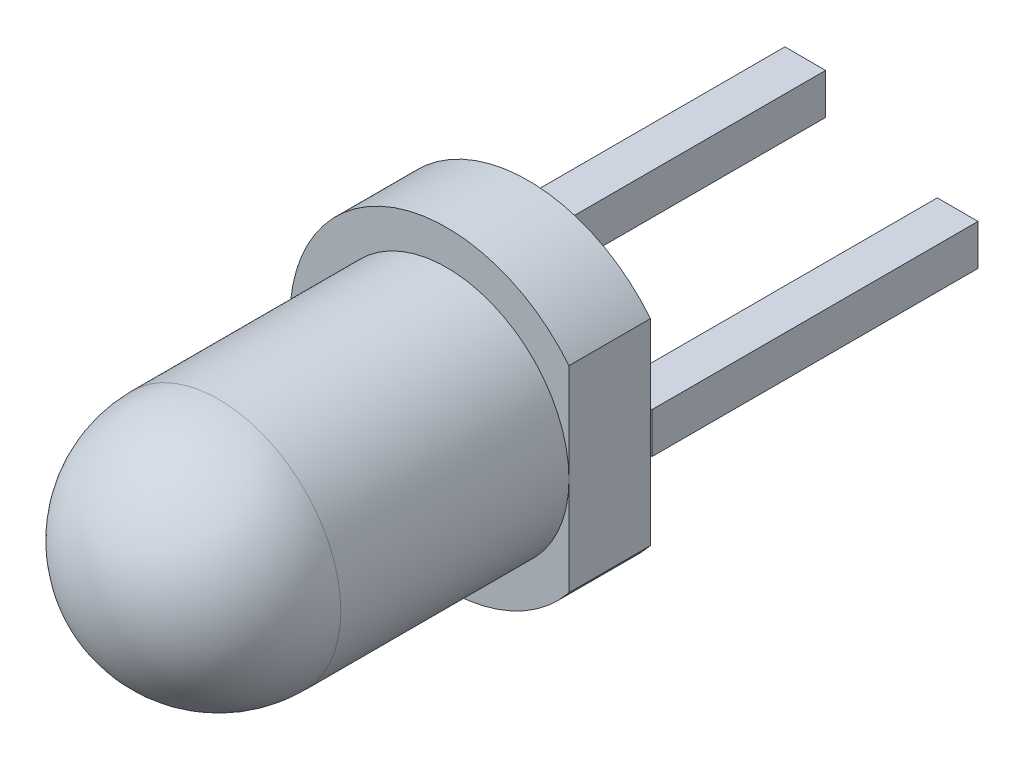
ISO-10303-21;
HEADER;
FILE_DESCRIPTION(('STEP AP214'),'2;1');
FILE_NAME('part.step','',(''),(''),'','','');
FILE_SCHEMA(('AUTOMOTIVE_DESIGN { 1 0 10303 214 1 1 1 1 }'));
ENDSEC;
DATA;
#1=APPLICATION_CONTEXT('core data for automotive mechanical design processes');
#2=APPLICATION_PROTOCOL_DEFINITION('international standard','automotive_design',2000,#1);
#3=PRODUCT_CONTEXT('',#1,'mechanical');
#4=PRODUCT('Part','Part','',(#3));
#5=PRODUCT_RELATED_PRODUCT_CATEGORY('part','',(#4));
#6=PRODUCT_DEFINITION_FORMATION('','',#4);
#7=PRODUCT_DEFINITION_CONTEXT('part definition',#1,'design');
#8=PRODUCT_DEFINITION('design','',#6,#7);
#9=PRODUCT_DEFINITION_SHAPE('','',#8);
#10=(LENGTH_UNIT() NAMED_UNIT(*) SI_UNIT(.MILLI.,.METRE.));
#11=(NAMED_UNIT(*) PLANE_ANGLE_UNIT() SI_UNIT($,.RADIAN.));
#12=(NAMED_UNIT(*) SI_UNIT($,.STERADIAN.) SOLID_ANGLE_UNIT());
#13=UNCERTAINTY_MEASURE_WITH_UNIT(LENGTH_MEASURE(1.E-05),#10,'distance_accuracy_value','');
#14=(GEOMETRIC_REPRESENTATION_CONTEXT(3) GLOBAL_UNCERTAINTY_ASSIGNED_CONTEXT((#13)) GLOBAL_UNIT_ASSIGNED_CONTEXT((#10,
#11,#12)) REPRESENTATION_CONTEXT('',''));
#15=CARTESIAN_POINT('',(0.,0.,0.));
#16=DIRECTION('',(0.,0.,1.));
#17=DIRECTION('',(1.,0.,0.));
#18=AXIS2_PLACEMENT_3D('',#15,#16,#17);
#19=CARTESIAN_POINT('',(-1.02,0.25,-26.4));
#20=DIRECTION('',(0.,1.,0.));
#21=DIRECTION('',(1.,0.,0.));
#22=AXIS2_PLACEMENT_3D('',#19,#20,#21);
#23=PLANE('',#22);
#24=DIRECTION('',(0.,0.,1.));
#25=VECTOR('',#24,1.);
#26=CARTESIAN_POINT('',(-1.02,0.25,-26.4));
#27=LINE('',#26,#25);
#28=CARTESIAN_POINT('',(-1.02,0.25,-4.67));
#29=VERTEX_POINT('',#28);
#30=CARTESIAN_POINT('',(-1.02,0.25,0.));
#31=VERTEX_POINT('',#30);
#32=EDGE_CURVE('E59',#29,#31,#27,.T.);
#33=ORIENTED_EDGE('',*,*,#32,.F.);
#34=DIRECTION('',(-1.,0.,0.));
#35=VECTOR('',#34,1.);
#36=CARTESIAN_POINT('',(-0.895,0.25,-4.67));
#37=LINE('',#36,#35);
#38=CARTESIAN_POINT('',(-1.52,0.25,-4.67));
#39=VERTEX_POINT('',#38);
#40=EDGE_CURVE('E331',#29,#39,#37,.T.);
#41=ORIENTED_EDGE('',*,*,#40,.T.);
#42=DIRECTION('',(0.,0.,1.));
#43=VECTOR('',#42,1.);
#44=CARTESIAN_POINT('',(-1.52,0.25,-26.4));
#45=LINE('',#44,#43);
#46=CARTESIAN_POINT('',(-1.52,0.25,0.));
#47=VERTEX_POINT('',#46);
#48=EDGE_CURVE('E230',#39,#47,#45,.T.);
#49=ORIENTED_EDGE('',*,*,#48,.T.);
#50=DIRECTION('',(-1.,0.,0.));
#51=VECTOR('',#50,1.);
#52=CARTESIAN_POINT('',(-1.02,0.25,0.));
#53=LINE('',#52,#51);
#54=EDGE_CURVE('E220',#31,#47,#53,.T.);
#55=ORIENTED_EDGE('',*,*,#54,.F.);
#56=EDGE_LOOP('',(#33,#41,#49,#55));
#57=FACE_BOUND('',#56,.T.);
#58=ADVANCED_FACE('F50',(#57),#23,.T.);
#59=CARTESIAN_POINT('',(-1.52,-0.25,-26.4));
#60=DIRECTION('',(0.,-1.,0.));
#61=DIRECTION('',(0.,0.,-1.));
#62=AXIS2_PLACEMENT_3D('',#59,#60,#61);
#63=PLANE('',#62);
#64=DIRECTION('',(0.,0.,1.));
#65=VECTOR('',#64,1.);
#66=CARTESIAN_POINT('',(-1.52,-0.25,-26.4));
#67=LINE('',#66,#65);
#68=CARTESIAN_POINT('',(-1.52,-0.25,-4.67));
#69=VERTEX_POINT('',#68);
#70=CARTESIAN_POINT('',(-1.52,-0.25,0.));
#71=VERTEX_POINT('',#70);
#72=EDGE_CURVE('E180',#69,#71,#67,.T.);
#73=ORIENTED_EDGE('',*,*,#72,.F.);
#74=DIRECTION('',(1.,0.,0.));
#75=VECTOR('',#74,1.);
#76=CARTESIAN_POINT('',(-0.895,-0.25,-4.67));
#77=LINE('',#76,#75);
#78=CARTESIAN_POINT('',(-1.02,-0.25,-4.67));
#79=VERTEX_POINT('',#78);
#80=EDGE_CURVE('E323',#69,#79,#77,.T.);
#81=ORIENTED_EDGE('',*,*,#80,.T.);
#82=DIRECTION('',(0.,0.,1.));
#83=VECTOR('',#82,1.);
#84=CARTESIAN_POINT('',(-1.02,-0.25,-26.4));
#85=LINE('',#84,#83);
#86=CARTESIAN_POINT('',(-1.02,-0.25,0.));
#87=VERTEX_POINT('',#86);
#88=EDGE_CURVE('E184',#79,#87,#85,.T.);
#89=ORIENTED_EDGE('',*,*,#88,.T.);
#90=DIRECTION('',(1.,0.,0.));
#91=VECTOR('',#90,1.);
#92=CARTESIAN_POINT('',(-1.52,-0.25,0.));
#93=LINE('',#92,#91);
#94=EDGE_CURVE('E208',#71,#87,#93,.T.);
#95=ORIENTED_EDGE('',*,*,#94,.F.);
#96=EDGE_LOOP('',(#73,#81,#89,#95));
#97=FACE_BOUND('',#96,.T.);
#98=ADVANCED_FACE('F322',(#97),#63,.T.);
#99=CARTESIAN_POINT('',(1.52,0.25,-26.4));
#100=DIRECTION('',(-1.,0.,0.));
#101=DIRECTION('',(0.,0.,1.));
#102=AXIS2_PLACEMENT_3D('',#99,#100,#101);
#103=PLANE('',#102);
#104=DIRECTION('',(0.,-1.,0.));
#105=VECTOR('',#104,1.);
#106=CARTESIAN_POINT('',(1.52,0.25,-4.));
#107=LINE('',#106,#105);
#108=CARTESIAN_POINT('',(1.52,0.25,-4.));
#109=VERTEX_POINT('',#108);
#110=CARTESIAN_POINT('',(1.52,-0.25,-4.));
#111=VERTEX_POINT('',#110);
#112=EDGE_CURVE('E198',#109,#111,#107,.T.);
#113=ORIENTED_EDGE('',*,*,#112,.F.);
#114=DIRECTION('',(0.,0.,1.));
#115=VECTOR('',#114,1.);
#116=CARTESIAN_POINT('',(1.52,0.25,-26.4));
#117=LINE('',#116,#115);
#118=CARTESIAN_POINT('',(1.52,0.25,0.));
#119=VERTEX_POINT('',#118);
#120=EDGE_CURVE('E204',#109,#119,#117,.T.);
#121=ORIENTED_EDGE('',*,*,#120,.T.);
#122=DIRECTION('',(0.,-1.,0.));
#123=VECTOR('',#122,1.);
#124=CARTESIAN_POINT('',(1.52,0.25,0.));
#125=LINE('',#124,#123);
#126=CARTESIAN_POINT('',(1.52,-0.25,0.));
#127=VERTEX_POINT('',#126);
#128=EDGE_CURVE('E233',#119,#127,#125,.T.);
#129=ORIENTED_EDGE('',*,*,#128,.T.);
#130=DIRECTION('',(0.,0.,1.));
#131=VECTOR('',#130,1.);
#132=CARTESIAN_POINT('',(1.52,-0.25,-26.4));
#133=LINE('',#132,#131);
#134=EDGE_CURVE('E78',#111,#127,#133,.T.);
#135=ORIENTED_EDGE('',*,*,#134,.F.);
#136=EDGE_LOOP('',(#113,#121,#129,#135));
#137=FACE_BOUND('',#136,.T.);
#138=ADVANCED_FACE('F367',(#137),#103,.F.);
#139=CARTESIAN_POINT('',(1.52,-0.25,-26.4));
#140=DIRECTION('',(0.,1.,0.));
#141=DIRECTION('',(1.,0.,0.));
#142=AXIS2_PLACEMENT_3D('',#139,#140,#141);
#143=PLANE('',#142);
#144=DIRECTION('',(1.,0.,0.));
#145=VECTOR('',#144,1.);
#146=CARTESIAN_POINT('',(1.645,-0.25,-4.));
#147=LINE('',#146,#145);
#148=CARTESIAN_POINT('',(1.02,-0.25,-4.));
#149=VERTEX_POINT('',#148);
#150=EDGE_CURVE('E338',#149,#111,#147,.T.);
#151=ORIENTED_EDGE('',*,*,#150,.T.);
#152=ORIENTED_EDGE('',*,*,#134,.T.);
#153=DIRECTION('',(-1.,0.,0.));
#154=VECTOR('',#153,1.);
#155=CARTESIAN_POINT('',(1.52,-0.25,0.));
#156=LINE('',#155,#154);
#157=CARTESIAN_POINT('',(1.5,-0.25,0.));
#158=VERTEX_POINT('',#157);
#159=EDGE_CURVE('E212',#127,#158,#156,.T.);
#160=ORIENTED_EDGE('',*,*,#159,.T.);
#161=DIRECTION('',(-1.,0.,0.));
#162=VECTOR('',#161,1.);
#163=CARTESIAN_POINT('',(1.52,-0.25,0.));
#164=LINE('',#163,#162);
#165=CARTESIAN_POINT('',(1.02,-0.25,0.));
#166=VERTEX_POINT('',#165);
#167=EDGE_CURVE('E170',#158,#166,#164,.T.);
#168=ORIENTED_EDGE('',*,*,#167,.T.);
#169=DIRECTION('',(0.,0.,1.));
#170=VECTOR('',#169,1.);
#171=CARTESIAN_POINT('',(1.02,-0.25,-26.4));
#172=LINE('',#171,#170);
#173=EDGE_CURVE('E189',#149,#166,#172,.T.);
#174=ORIENTED_EDGE('',*,*,#173,.F.);
#175=EDGE_LOOP('',(#151,#152,#160,#168,#174));
#176=FACE_BOUND('',#175,.T.);
#177=ADVANCED_FACE('F364',(#176),#143,.F.);
#178=CARTESIAN_POINT('',(1.02,-0.25,-26.4));
#179=DIRECTION('',(1.,0.,0.));
#180=DIRECTION('',(0.,1.,0.));
#181=AXIS2_PLACEMENT_3D('',#178,#179,#180);
#182=PLANE('',#181);
#183=DIRECTION('',(0.,1.,0.));
#184=VECTOR('',#183,1.);
#185=CARTESIAN_POINT('',(1.02,-0.25,-4.));
#186=LINE('',#185,#184);
#187=CARTESIAN_POINT('',(1.02,0.25,-4.));
#188=VERTEX_POINT('',#187);
#189=EDGE_CURVE('E65',#149,#188,#186,.T.);
#190=ORIENTED_EDGE('',*,*,#189,.F.);
#191=ORIENTED_EDGE('',*,*,#173,.T.);
#192=DIRECTION('',(0.,1.,0.));
#193=VECTOR('',#192,1.);
#194=CARTESIAN_POINT('',(1.02,-0.25,0.));
#195=LINE('',#194,#193);
#196=CARTESIAN_POINT('',(1.02,0.25,0.));
#197=VERTEX_POINT('',#196);
#198=EDGE_CURVE('E175',#166,#197,#195,.T.);
#199=ORIENTED_EDGE('',*,*,#198,.T.);
#200=DIRECTION('',(0.,0.,1.));
#201=VECTOR('',#200,1.);
#202=CARTESIAN_POINT('',(1.02,0.25,-26.4));
#203=LINE('',#202,#201);
#204=EDGE_CURVE('E201',#188,#197,#203,.T.);
#205=ORIENTED_EDGE('',*,*,#204,.F.);
#206=EDGE_LOOP('',(#190,#191,#199,#205));
#207=FACE_BOUND('',#206,.T.);
#208=ADVANCED_FACE('F361',(#207),#182,.F.);
#209=CARTESIAN_POINT('',(1.02,0.25,-26.4));
#210=DIRECTION('',(0.,-1.,0.));
#211=DIRECTION('',(0.,0.,-1.));
#212=AXIS2_PLACEMENT_3D('',#209,#210,#211);
#213=PLANE('',#212);
#214=DIRECTION('',(1.,0.,0.));
#215=VECTOR('',#214,1.);
#216=CARTESIAN_POINT('',(1.02,0.25,-4.));
#217=LINE('',#216,#215);
#218=EDGE_CURVE('E13',#188,#109,#217,.T.);
#219=ORIENTED_EDGE('',*,*,#218,.F.);
#220=ORIENTED_EDGE('',*,*,#204,.T.);
#221=DIRECTION('',(1.,0.,0.));
#222=VECTOR('',#221,1.);
#223=CARTESIAN_POINT('',(1.02,0.25,0.));
#224=LINE('',#223,#222);
#225=CARTESIAN_POINT('',(1.5,0.25,0.));
#226=VERTEX_POINT('',#225);
#227=EDGE_CURVE('E289',#197,#226,#224,.T.);
#228=ORIENTED_EDGE('',*,*,#227,.T.);
#229=DIRECTION('',(1.,0.,0.));
#230=VECTOR('',#229,1.);
#231=CARTESIAN_POINT('',(1.02,0.25,0.));
#232=LINE('',#231,#230);
#233=EDGE_CURVE('E192',#226,#119,#232,.T.);
#234=ORIENTED_EDGE('',*,*,#233,.T.);
#235=ORIENTED_EDGE('',*,*,#120,.F.);
#236=EDGE_LOOP('',(#219,#220,#228,#234,#235));
#237=FACE_BOUND('',#236,.T.);
#238=ADVANCED_FACE('F357',(#237),#213,.F.);
#239=CARTESIAN_POINT('',(-1.02,-0.25,-26.4));
#240=DIRECTION('',(1.,0.,0.));
#241=DIRECTION('',(0.,1.,0.));
#242=AXIS2_PLACEMENT_3D('',#239,#240,#241);
#243=PLANE('',#242);
#244=ORIENTED_EDGE('',*,*,#88,.F.);
#245=DIRECTION('',(0.,1.,0.));
#246=VECTOR('',#245,1.);
#247=CARTESIAN_POINT('',(-1.02,-0.25,-4.67));
#248=LINE('',#247,#246);
#249=EDGE_CURVE('E188',#79,#29,#248,.T.);
#250=ORIENTED_EDGE('',*,*,#249,.T.);
#251=ORIENTED_EDGE('',*,*,#32,.T.);
#252=DIRECTION('',(0.,1.,0.));
#253=VECTOR('',#252,1.);
#254=CARTESIAN_POINT('',(-1.02,-0.25,0.));
#255=LINE('',#254,#253);
#256=EDGE_CURVE('E216',#87,#31,#255,.T.);
#257=ORIENTED_EDGE('',*,*,#256,.F.);
#258=EDGE_LOOP('',(#244,#250,#251,#257));
#259=FACE_BOUND('',#258,.T.);
#260=ADVANCED_FACE('F326',(#259),#243,.T.);
#261=CARTESIAN_POINT('',(-1.52,0.25,-26.4));
#262=DIRECTION('',(-1.,0.,0.));
#263=DIRECTION('',(0.,0.,1.));
#264=AXIS2_PLACEMENT_3D('',#261,#262,#263);
#265=PLANE('',#264);
#266=ORIENTED_EDGE('',*,*,#48,.F.);
#267=DIRECTION('',(0.,-1.,0.));
#268=VECTOR('',#267,1.);
#269=CARTESIAN_POINT('',(-1.52,0.25,-4.67));
#270=LINE('',#269,#268);
#271=EDGE_CURVE('E229',#39,#69,#270,.T.);
#272=ORIENTED_EDGE('',*,*,#271,.T.);
#273=ORIENTED_EDGE('',*,*,#72,.T.);
#274=DIRECTION('',(0.,-1.,0.));
#275=VECTOR('',#274,1.);
#276=CARTESIAN_POINT('',(-1.52,0.25,0.));
#277=LINE('',#276,#275);
#278=EDGE_CURVE('E221',#47,#71,#277,.T.);
#279=ORIENTED_EDGE('',*,*,#278,.F.);
#280=EDGE_LOOP('',(#266,#272,#273,#279));
#281=FACE_BOUND('',#280,.T.);
#282=ADVANCED_FACE('F310',(#281),#265,.T.);
#283=CARTESIAN_POINT('',(1.52,-0.25,0.));
#284=DIRECTION('',(0.,0.,-1.));
#285=DIRECTION('',(0.,-1.,0.));
#286=AXIS2_PLACEMENT_3D('',#283,#284,#285);
#287=PLANE('',#286);
#288=ORIENTED_EDGE('',*,*,#233,.F.);
#289=DIRECTION('',(0.,-1.,0.));
#290=VECTOR('',#289,1.);
#291=CARTESIAN_POINT('',(1.5,0.,0.));
#292=LINE('',#291,#290);
#293=EDGE_CURVE('E154',#226,#158,#292,.T.);
#294=ORIENTED_EDGE('',*,*,#293,.T.);
#295=ORIENTED_EDGE('',*,*,#159,.F.);
#296=ORIENTED_EDGE('',*,*,#128,.F.);
#297=EDGE_LOOP('',(#288,#294,#295,#296));
#298=FACE_BOUND('',#297,.T.);
#299=ADVANCED_FACE('F354',(#298),#287,.F.);
#300=CARTESIAN_POINT('',(0.,0.,5.3));
#301=DIRECTION('',(0.,0.,1.));
#302=DIRECTION('',(-1.,0.,0.));
#303=AXIS2_PLACEMENT_3D('',#300,#301,#302);
#304=CYLINDRICAL_SURFACE('',#303,1.5);
#305=CARTESIAN_POINT('',(0.,0.,3.8));
#306=DIRECTION('',(0.,0.,-1.));
#307=DIRECTION('',(-1.,0.,0.));
#308=AXIS2_PLACEMENT_3D('',#305,#306,#307);
#309=CIRCLE('',#308,1.5);
#310=CARTESIAN_POINT('',(-1.5,0.,3.8));
#311=VERTEX_POINT('',#310);
#312=EDGE_CURVE('E185',#311,#311,#309,.T.);
#313=ORIENTED_EDGE('',*,*,#312,.T.);
#314=EDGE_LOOP('',(#313));
#315=FACE_BOUND('',#314,.T.);
#316=CARTESIAN_POINT('',(0.,0.,1.));
#317=DIRECTION('',(0.,0.,-1.));
#318=DIRECTION('',(0.,1.,0.));
#319=AXIS2_PLACEMENT_3D('',#316,#317,#318);
#320=CIRCLE('',#319,1.5);
#321=CARTESIAN_POINT('',(1.5,0.,1.));
#322=VERTEX_POINT('',#321);
#323=EDGE_CURVE('E190',#322,#322,#320,.T.);
#324=ORIENTED_EDGE('',*,*,#323,.F.);
#325=EDGE_LOOP('',(#324));
#326=FACE_BOUND('',#325,.T.);
#327=ADVANCED_FACE('F395',(#315,#326),#304,.T.);
#328=CARTESIAN_POINT('',(0.,0.,1.));
#329=DIRECTION('',(0.,0.,-1.));
#330=DIRECTION('',(0.,-1.,0.));
#331=AXIS2_PLACEMENT_3D('',#328,#329,#330);
#332=PLANE('',#331);
#333=DIRECTION('',(0.,-1.,0.));
#334=VECTOR('',#333,1.);
#335=CARTESIAN_POINT('',(1.5,0.,1.));
#336=LINE('',#335,#334);
#337=CARTESIAN_POINT('',(1.5,-1.20649285120137,1.));
#338=VERTEX_POINT('',#337);
#339=EDGE_CURVE('E151',#322,#338,#336,.T.);
#340=ORIENTED_EDGE('',*,*,#339,.F.);
#341=ORIENTED_EDGE('',*,*,#323,.T.);
#342=DIRECTION('',(0.,-1.,0.));
#343=VECTOR('',#342,1.);
#344=CARTESIAN_POINT('',(1.5,0.,1.));
#345=LINE('',#344,#343);
#346=CARTESIAN_POINT('',(1.5,1.20649285120137,1.));
#347=VERTEX_POINT('',#346);
#348=EDGE_CURVE('E224',#347,#322,#345,.T.);
#349=ORIENTED_EDGE('',*,*,#348,.F.);
#350=CARTESIAN_POINT('',(0.,0.,1.));
#351=DIRECTION('',(0.,0.,-1.));
#352=DIRECTION('',(1.,0.,0.));
#353=AXIS2_PLACEMENT_3D('',#350,#351,#352);
#354=CIRCLE('',#353,1.925);
#355=EDGE_CURVE('E193',#338,#347,#354,.T.);
#356=ORIENTED_EDGE('',*,*,#355,.F.);
#357=EDGE_LOOP('',(#340,#341,#349,#356));
#358=FACE_BOUND('',#357,.T.);
#359=ADVANCED_FACE('F405',(#358),#332,.F.);
#360=CARTESIAN_POINT('',(0.,0.,1.));
#361=DIRECTION('',(0.,0.,1.));
#362=DIRECTION('',(-1.,0.,0.));
#363=AXIS2_PLACEMENT_3D('',#360,#361,#362);
#364=CYLINDRICAL_SURFACE('',#363,1.925);
#365=CARTESIAN_POINT('',(0.,0.,0.));
#366=DIRECTION('',(0.,0.,-1.));
#367=DIRECTION('',(1.,0.,0.));
#368=AXIS2_PLACEMENT_3D('',#365,#366,#367);
#369=CIRCLE('',#368,1.925);
#370=CARTESIAN_POINT('',(1.5,-1.20649285120137,0.));
#371=VERTEX_POINT('',#370);
#372=CARTESIAN_POINT('',(1.5,1.20649285120137,0.));
#373=VERTEX_POINT('',#372);
#374=EDGE_CURVE('E157',#371,#373,#369,.T.);
#375=ORIENTED_EDGE('',*,*,#374,.F.);
#376=DIRECTION('',(0.,0.,1.));
#377=VECTOR('',#376,1.);
#378=CARTESIAN_POINT('',(1.5,-1.20649285120137,1.));
#379=LINE('',#378,#377);
#380=EDGE_CURVE('E142',#371,#338,#379,.T.);
#381=ORIENTED_EDGE('',*,*,#380,.T.);
#382=ORIENTED_EDGE('',*,*,#355,.T.);
#383=DIRECTION('',(0.,0.,-1.));
#384=VECTOR('',#383,1.);
#385=CARTESIAN_POINT('',(1.5,1.20649285120137,1.));
#386=LINE('',#385,#384);
#387=EDGE_CURVE('E160',#347,#373,#386,.T.);
#388=ORIENTED_EDGE('',*,*,#387,.T.);
#389=EDGE_LOOP('',(#375,#381,#382,#388));
#390=FACE_BOUND('',#389,.T.);
#391=ADVANCED_FACE('F158',(#390),#364,.T.);
#392=CARTESIAN_POINT('',(1.5,1.925,5.53579262617378));
#393=DIRECTION('',(1.,0.,0.));
#394=DIRECTION('',(0.,1.,0.));
#395=AXIS2_PLACEMENT_3D('',#392,#393,#394);
#396=PLANE('',#395);
#397=DIRECTION('',(0.,-1.,0.));
#398=VECTOR('',#397,1.);
#399=CARTESIAN_POINT('',(1.5,0.,0.));
#400=LINE('',#399,#398);
#401=EDGE_CURVE('E164',#373,#226,#400,.T.);
#402=ORIENTED_EDGE('',*,*,#401,.F.);
#403=ORIENTED_EDGE('',*,*,#387,.F.);
#404=ORIENTED_EDGE('',*,*,#348,.T.);
#405=ORIENTED_EDGE('',*,*,#339,.T.);
#406=ORIENTED_EDGE('',*,*,#380,.F.);
#407=DIRECTION('',(0.,-1.,0.));
#408=VECTOR('',#407,1.);
#409=CARTESIAN_POINT('',(1.5,0.,0.));
#410=LINE('',#409,#408);
#411=EDGE_CURVE('E147',#158,#371,#410,.T.);
#412=ORIENTED_EDGE('',*,*,#411,.F.);
#413=ORIENTED_EDGE('',*,*,#293,.F.);
#414=EDGE_LOOP('',(#402,#403,#404,#405,#406,#412,#413));
#415=FACE_BOUND('',#414,.T.);
#416=ADVANCED_FACE('F52',(#415),#396,.T.);
#417=CARTESIAN_POINT('',(0.,0.,0.));
#418=DIRECTION('',(0.,0.,-1.));
#419=DIRECTION('',(0.,-1.,0.));
#420=AXIS2_PLACEMENT_3D('',#417,#418,#419);
#421=PLANE('',#420);
#422=ORIENTED_EDGE('',*,*,#278,.T.);
#423=ORIENTED_EDGE('',*,*,#94,.T.);
#424=ORIENTED_EDGE('',*,*,#256,.T.);
#425=ORIENTED_EDGE('',*,*,#54,.T.);
#426=EDGE_LOOP('',(#422,#423,#424,#425));
#427=FACE_BOUND('',#426,.T.);
#428=ORIENTED_EDGE('',*,*,#227,.F.);
#429=ORIENTED_EDGE('',*,*,#198,.F.);
#430=ORIENTED_EDGE('',*,*,#167,.F.);
#431=ORIENTED_EDGE('',*,*,#411,.T.);
#432=ORIENTED_EDGE('',*,*,#374,.T.);
#433=ORIENTED_EDGE('',*,*,#401,.T.);
#434=EDGE_LOOP('',(#428,#429,#430,#431,#432,#433));
#435=FACE_BOUND('',#434,.T.);
#436=ADVANCED_FACE('F167',(#427,#435),#421,.T.);
#437=CARTESIAN_POINT('',(0.,0.,3.8));
#438=DIRECTION('',(0.,0.,1.));
#439=DIRECTION('',(1.,0.,0.));
#440=AXIS2_PLACEMENT_3D('',#437,#438,#439);
#441=SPHERICAL_SURFACE('',#440,1.5);
#442=ORIENTED_EDGE('',*,*,#312,.F.);
#443=EDGE_LOOP('',(#442));
#444=FACE_BOUND('',#443,.T.);
#445=ADVANCED_FACE('F387',(#444),#441,.T.);
#446=CARTESIAN_POINT('',(0.,0.,-4.));
#447=DIRECTION('',(0.,0.,-1.));
#448=DIRECTION('',(0.,-1.,0.));
#449=AXIS2_PLACEMENT_3D('',#446,#447,#448);
#450=PLANE('',#449);
#451=ORIENTED_EDGE('',*,*,#112,.T.);
#452=ORIENTED_EDGE('',*,*,#150,.F.);
#453=ORIENTED_EDGE('',*,*,#189,.T.);
#454=ORIENTED_EDGE('',*,*,#218,.T.);
#455=EDGE_LOOP('',(#451,#452,#453,#454));
#456=FACE_BOUND('',#455,.T.);
#457=ADVANCED_FACE('F388',(#456),#450,.T.);
#458=CARTESIAN_POINT('',(-0.895,-0.25,-4.67));
#459=DIRECTION('',(0.,0.,-1.));
#460=DIRECTION('',(0.,-1.,0.));
#461=AXIS2_PLACEMENT_3D('',#458,#459,#460);
#462=PLANE('',#461);
#463=ORIENTED_EDGE('',*,*,#80,.F.);
#464=ORIENTED_EDGE('',*,*,#271,.F.);
#465=ORIENTED_EDGE('',*,*,#40,.F.);
#466=ORIENTED_EDGE('',*,*,#249,.F.);
#467=EDGE_LOOP('',(#463,#464,#465,#466));
#468=FACE_BOUND('',#467,.T.);
#469=ADVANCED_FACE('F418',(#468),#462,.T.);
#470=CLOSED_SHELL('',(#58,#98,#138,#177,#208,#238,#260,#282,#299,#327,#359,#391,#416,#436,#445,
#457,#469));
#471=MANIFOLD_SOLID_BREP('B2',#470);
#472=ADVANCED_BREP_SHAPE_REPRESENTATION('',(#18,#471),#14);
#473=SHAPE_DEFINITION_REPRESENTATION(#9,#472);
ENDSEC;
END-ISO-10303-21;
